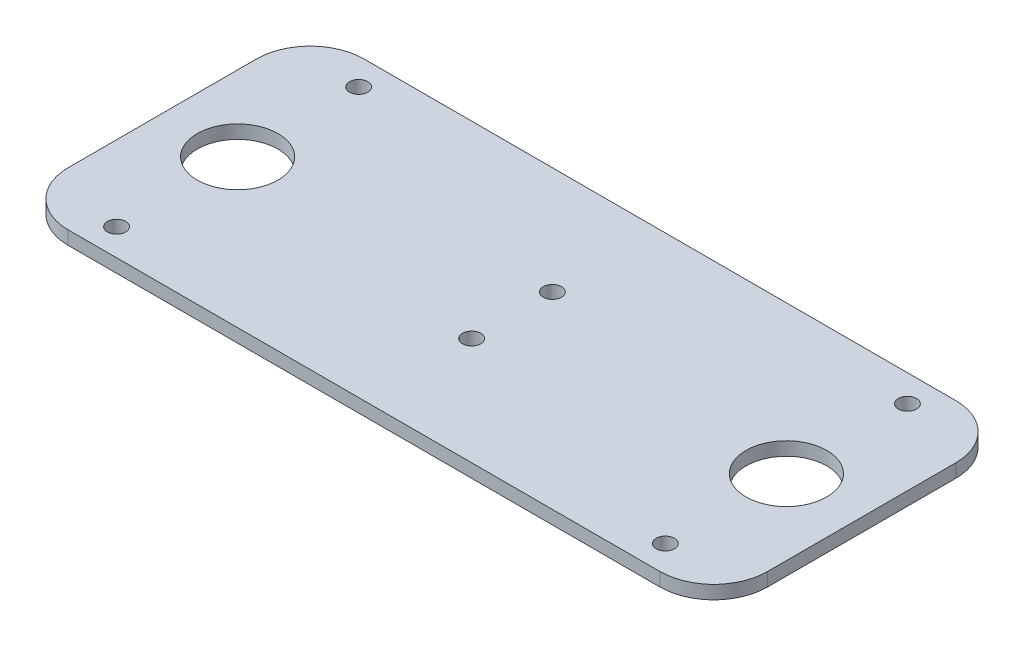
ISO-10303-21;
HEADER;
FILE_DESCRIPTION(('STEP AP214'),'2;1');
FILE_NAME('part.step','',(''),(''),'','','');
FILE_SCHEMA(('AUTOMOTIVE_DESIGN { 1 0 10303 214 1 1 1 1 }'));
ENDSEC;
DATA;
#1=APPLICATION_CONTEXT('core data for automotive mechanical design processes');
#2=APPLICATION_PROTOCOL_DEFINITION('international standard','automotive_design',2000,#1);
#3=PRODUCT_CONTEXT('',#1,'mechanical');
#4=PRODUCT('Part','Part','',(#3));
#5=PRODUCT_RELATED_PRODUCT_CATEGORY('part','',(#4));
#6=PRODUCT_DEFINITION_FORMATION('','',#4);
#7=PRODUCT_DEFINITION_CONTEXT('part definition',#1,'design');
#8=PRODUCT_DEFINITION('design','',#6,#7);
#9=PRODUCT_DEFINITION_SHAPE('','',#8);
#10=(LENGTH_UNIT() NAMED_UNIT(*) SI_UNIT(.MILLI.,.METRE.));
#11=(NAMED_UNIT(*) PLANE_ANGLE_UNIT() SI_UNIT($,.RADIAN.));
#12=(NAMED_UNIT(*) SI_UNIT($,.STERADIAN.) SOLID_ANGLE_UNIT());
#13=UNCERTAINTY_MEASURE_WITH_UNIT(LENGTH_MEASURE(1.E-05),#10,'distance_accuracy_value','');
#14=(GEOMETRIC_REPRESENTATION_CONTEXT(3) GLOBAL_UNCERTAINTY_ASSIGNED_CONTEXT((#13)) GLOBAL_UNIT_ASSIGNED_CONTEXT((#10,
#11,#12)) REPRESENTATION_CONTEXT('',''));
#15=CARTESIAN_POINT('',(0.,0.,0.));
#16=DIRECTION('',(0.,0.,1.));
#17=DIRECTION('',(1.,0.,0.));
#18=AXIS2_PLACEMENT_3D('',#15,#16,#17);
#19=CARTESIAN_POINT('',(10.,2.5,-45.));
#20=DIRECTION('',(0.,-1.,0.));
#21=DIRECTION('',(0.,0.,-1.));
#22=AXIS2_PLACEMENT_3D('',#19,#20,#21);
#23=CYLINDRICAL_SURFACE('',#22,10.);
#24=CARTESIAN_POINT('',(10.,0.,-45.));
#25=DIRECTION('',(0.,1.,0.));
#26=DIRECTION('',(0.,0.,1.));
#27=AXIS2_PLACEMENT_3D('',#24,#25,#26);
#28=CIRCLE('',#27,10.);
#29=CARTESIAN_POINT('',(10.0000000000001,0.,-55.));
#30=VERTEX_POINT('',#29);
#31=CARTESIAN_POINT('',(0.,0.,-44.9999999999999));
#32=VERTEX_POINT('',#31);
#33=EDGE_CURVE('E137',#30,#32,#28,.T.);
#34=ORIENTED_EDGE('',*,*,#33,.T.);
#35=DIRECTION('',(0.,-1.,0.));
#36=VECTOR('',#35,1.);
#37=CARTESIAN_POINT('',(0.,2.5,-44.9999999999999));
#38=LINE('',#37,#36);
#39=CARTESIAN_POINT('',(0.,2.5,-44.9999999999999));
#40=VERTEX_POINT('',#39);
#41=EDGE_CURVE('E11',#40,#32,#38,.T.);
#42=ORIENTED_EDGE('',*,*,#41,.F.);
#43=CARTESIAN_POINT('',(10.,2.5,-45.));
#44=DIRECTION('',(0.,1.,0.));
#45=DIRECTION('',(0.,0.,1.));
#46=AXIS2_PLACEMENT_3D('',#43,#44,#45);
#47=CIRCLE('',#46,10.);
#48=CARTESIAN_POINT('',(10.0000000000001,2.5,-55.));
#49=VERTEX_POINT('',#48);
#50=EDGE_CURVE('E152',#49,#40,#47,.T.);
#51=ORIENTED_EDGE('',*,*,#50,.F.);
#52=DIRECTION('',(0.,-1.,0.));
#53=VECTOR('',#52,1.);
#54=CARTESIAN_POINT('',(10.0000000000001,2.5,-55.));
#55=LINE('',#54,#53);
#56=EDGE_CURVE('E133',#49,#30,#55,.T.);
#57=ORIENTED_EDGE('',*,*,#56,.T.);
#58=EDGE_LOOP('',(#34,#42,#51,#57));
#59=FACE_BOUND('',#58,.T.);
#60=ADVANCED_FACE('F41',(#59),#23,.T.);
#61=CARTESIAN_POINT('',(0.,2.5,-10.0000000000001));
#62=DIRECTION('',(1.,0.,0.));
#63=DIRECTION('',(0.,0.,-1.));
#64=AXIS2_PLACEMENT_3D('',#61,#62,#63);
#65=PLANE('',#64);
#66=DIRECTION('',(0.,0.,1.));
#67=VECTOR('',#66,1.);
#68=CARTESIAN_POINT('',(0.,0.,-10.0000000000001));
#69=LINE('',#68,#67);
#70=CARTESIAN_POINT('',(0.,0.,-10.0000000000001));
#71=VERTEX_POINT('',#70);
#72=EDGE_CURVE('E140',#32,#71,#69,.T.);
#73=ORIENTED_EDGE('',*,*,#72,.T.);
#74=DIRECTION('',(0.,-1.,0.));
#75=VECTOR('',#74,1.);
#76=CARTESIAN_POINT('',(0.,2.5,-10.0000000000001));
#77=LINE('',#76,#75);
#78=CARTESIAN_POINT('',(0.,2.5,-10.0000000000001));
#79=VERTEX_POINT('',#78);
#80=EDGE_CURVE('E49',#79,#71,#77,.T.);
#81=ORIENTED_EDGE('',*,*,#80,.F.);
#82=DIRECTION('',(0.,0.,1.));
#83=VECTOR('',#82,1.);
#84=CARTESIAN_POINT('',(0.,2.5,-10.0000000000001));
#85=LINE('',#84,#83);
#86=EDGE_CURVE('E100',#40,#79,#85,.T.);
#87=ORIENTED_EDGE('',*,*,#86,.F.);
#88=ORIENTED_EDGE('',*,*,#41,.T.);
#89=EDGE_LOOP('',(#73,#81,#87,#88));
#90=FACE_BOUND('',#89,.T.);
#91=ADVANCED_FACE('F275',(#90),#65,.F.);
#92=CARTESIAN_POINT('',(10.,2.5,-10.));
#93=DIRECTION('',(0.,-1.,0.));
#94=DIRECTION('',(0.,0.,-1.));
#95=AXIS2_PLACEMENT_3D('',#92,#93,#94);
#96=CYLINDRICAL_SURFACE('',#95,10.);
#97=CARTESIAN_POINT('',(10.,0.,-10.));
#98=DIRECTION('',(0.,1.,0.));
#99=DIRECTION('',(0.,0.,1.));
#100=AXIS2_PLACEMENT_3D('',#97,#98,#99);
#101=CIRCLE('',#100,10.);
#102=CARTESIAN_POINT('',(10.0000000000001,0.,0.));
#103=VERTEX_POINT('',#102);
#104=EDGE_CURVE('E143',#71,#103,#101,.T.);
#105=ORIENTED_EDGE('',*,*,#104,.T.);
#106=DIRECTION('',(0.,-1.,0.));
#107=VECTOR('',#106,1.);
#108=CARTESIAN_POINT('',(10.0000000000001,2.5,0.));
#109=LINE('',#108,#107);
#110=CARTESIAN_POINT('',(10.0000000000001,2.5,0.));
#111=VERTEX_POINT('',#110);
#112=EDGE_CURVE('E159',#111,#103,#109,.T.);
#113=ORIENTED_EDGE('',*,*,#112,.F.);
#114=CARTESIAN_POINT('',(10.,2.5,-10.));
#115=DIRECTION('',(0.,1.,0.));
#116=DIRECTION('',(0.,0.,1.));
#117=AXIS2_PLACEMENT_3D('',#114,#115,#116);
#118=CIRCLE('',#117,10.);
#119=EDGE_CURVE('E167',#79,#111,#118,.T.);
#120=ORIENTED_EDGE('',*,*,#119,.F.);
#121=ORIENTED_EDGE('',*,*,#80,.T.);
#122=EDGE_LOOP('',(#105,#113,#120,#121));
#123=FACE_BOUND('',#122,.T.);
#124=ADVANCED_FACE('F165',(#123),#96,.T.);
#125=CARTESIAN_POINT('',(10.0000000000001,2.5,0.));
#126=DIRECTION('',(0.,0.,-1.));
#127=DIRECTION('',(-1.,0.,0.));
#128=AXIS2_PLACEMENT_3D('',#125,#126,#127);
#129=PLANE('',#128);
#130=DIRECTION('',(1.,0.,0.));
#131=VECTOR('',#130,1.);
#132=CARTESIAN_POINT('',(10.0000000000001,0.,0.));
#133=LINE('',#132,#131);
#134=CARTESIAN_POINT('',(120.,0.,0.));
#135=VERTEX_POINT('',#134);
#136=EDGE_CURVE('E145',#103,#135,#133,.T.);
#137=ORIENTED_EDGE('',*,*,#136,.T.);
#138=DIRECTION('',(0.,-1.,0.));
#139=VECTOR('',#138,1.);
#140=CARTESIAN_POINT('',(120.,2.5,0.));
#141=LINE('',#140,#139);
#142=CARTESIAN_POINT('',(120.,2.5,0.));
#143=VERTEX_POINT('',#142);
#144=EDGE_CURVE('E156',#143,#135,#141,.T.);
#145=ORIENTED_EDGE('',*,*,#144,.F.);
#146=DIRECTION('',(1.,0.,0.));
#147=VECTOR('',#146,1.);
#148=CARTESIAN_POINT('',(10.0000000000001,2.5,0.));
#149=LINE('',#148,#147);
#150=EDGE_CURVE('E179',#111,#143,#149,.T.);
#151=ORIENTED_EDGE('',*,*,#150,.F.);
#152=ORIENTED_EDGE('',*,*,#112,.T.);
#153=EDGE_LOOP('',(#137,#145,#151,#152));
#154=FACE_BOUND('',#153,.T.);
#155=ADVANCED_FACE('F175',(#154),#129,.F.);
#156=CARTESIAN_POINT('',(120.,2.5,-10.));
#157=DIRECTION('',(0.,-1.,0.));
#158=DIRECTION('',(0.,0.,-1.));
#159=AXIS2_PLACEMENT_3D('',#156,#157,#158);
#160=CYLINDRICAL_SURFACE('',#159,10.);
#161=CARTESIAN_POINT('',(120.,0.,-10.));
#162=DIRECTION('',(0.,1.,0.));
#163=DIRECTION('',(0.,0.,-1.));
#164=AXIS2_PLACEMENT_3D('',#161,#162,#163);
#165=CIRCLE('',#164,10.);
#166=CARTESIAN_POINT('',(130.,0.,-10.0000000000001));
#167=VERTEX_POINT('',#166);
#168=EDGE_CURVE('E147',#135,#167,#165,.T.);
#169=ORIENTED_EDGE('',*,*,#168,.T.);
#170=DIRECTION('',(0.,-1.,0.));
#171=VECTOR('',#170,1.);
#172=CARTESIAN_POINT('',(130.,2.5,-10.0000000000001));
#173=LINE('',#172,#171);
#174=CARTESIAN_POINT('',(130.,2.5,-10.0000000000001));
#175=VERTEX_POINT('',#174);
#176=EDGE_CURVE('E128',#175,#167,#173,.T.);
#177=ORIENTED_EDGE('',*,*,#176,.F.);
#178=CARTESIAN_POINT('',(120.,2.5,-10.));
#179=DIRECTION('',(0.,1.,0.));
#180=DIRECTION('',(0.,0.,-1.));
#181=AXIS2_PLACEMENT_3D('',#178,#179,#180);
#182=CIRCLE('',#181,10.);
#183=EDGE_CURVE('E119',#143,#175,#182,.T.);
#184=ORIENTED_EDGE('',*,*,#183,.F.);
#185=ORIENTED_EDGE('',*,*,#144,.T.);
#186=EDGE_LOOP('',(#169,#177,#184,#185));
#187=FACE_BOUND('',#186,.T.);
#188=ADVANCED_FACE('F178',(#187),#160,.T.);
#189=CARTESIAN_POINT('',(130.,2.5,-10.0000000000001));
#190=DIRECTION('',(-1.,0.,0.));
#191=DIRECTION('',(0.,0.,1.));
#192=AXIS2_PLACEMENT_3D('',#189,#190,#191);
#193=PLANE('',#192);
#194=DIRECTION('',(0.,0.,-1.));
#195=VECTOR('',#194,1.);
#196=CARTESIAN_POINT('',(130.,0.,-10.0000000000001));
#197=LINE('',#196,#195);
#198=CARTESIAN_POINT('',(130.,0.,-44.9999999999999));
#199=VERTEX_POINT('',#198);
#200=EDGE_CURVE('E127',#167,#199,#197,.T.);
#201=ORIENTED_EDGE('',*,*,#200,.T.);
#202=DIRECTION('',(0.,-1.,0.));
#203=VECTOR('',#202,1.);
#204=CARTESIAN_POINT('',(130.,2.5,-44.9999999999999));
#205=LINE('',#204,#203);
#206=CARTESIAN_POINT('',(130.,2.5,-44.9999999999999));
#207=VERTEX_POINT('',#206);
#208=EDGE_CURVE('E124',#207,#199,#205,.T.);
#209=ORIENTED_EDGE('',*,*,#208,.F.);
#210=DIRECTION('',(0.,0.,-1.));
#211=VECTOR('',#210,1.);
#212=CARTESIAN_POINT('',(130.,2.5,-10.0000000000001));
#213=LINE('',#212,#211);
#214=EDGE_CURVE('E113',#175,#207,#213,.T.);
#215=ORIENTED_EDGE('',*,*,#214,.F.);
#216=ORIENTED_EDGE('',*,*,#176,.T.);
#217=EDGE_LOOP('',(#201,#209,#215,#216));
#218=FACE_BOUND('',#217,.T.);
#219=ADVANCED_FACE('F125',(#218),#193,.F.);
#220=CARTESIAN_POINT('',(120.,2.5,-45.));
#221=DIRECTION('',(0.,-1.,0.));
#222=DIRECTION('',(0.,0.,-1.));
#223=AXIS2_PLACEMENT_3D('',#220,#221,#222);
#224=CYLINDRICAL_SURFACE('',#223,10.);
#225=CARTESIAN_POINT('',(120.,0.,-45.));
#226=DIRECTION('',(0.,1.,0.));
#227=DIRECTION('',(0.,0.,-1.));
#228=AXIS2_PLACEMENT_3D('',#225,#226,#227);
#229=CIRCLE('',#228,10.);
#230=CARTESIAN_POINT('',(120.,0.,-55.));
#231=VERTEX_POINT('',#230);
#232=EDGE_CURVE('E86',#199,#231,#229,.T.);
#233=ORIENTED_EDGE('',*,*,#232,.T.);
#234=DIRECTION('',(0.,-1.,0.));
#235=VECTOR('',#234,1.);
#236=CARTESIAN_POINT('',(120.,2.5,-55.));
#237=LINE('',#236,#235);
#238=CARTESIAN_POINT('',(120.,2.5,-55.));
#239=VERTEX_POINT('',#238);
#240=EDGE_CURVE('E129',#239,#231,#237,.T.);
#241=ORIENTED_EDGE('',*,*,#240,.F.);
#242=CARTESIAN_POINT('',(120.,2.5,-45.));
#243=DIRECTION('',(0.,1.,0.));
#244=DIRECTION('',(0.,0.,-1.));
#245=AXIS2_PLACEMENT_3D('',#242,#243,#244);
#246=CIRCLE('',#245,10.);
#247=EDGE_CURVE('E117',#207,#239,#246,.T.);
#248=ORIENTED_EDGE('',*,*,#247,.F.);
#249=ORIENTED_EDGE('',*,*,#208,.T.);
#250=EDGE_LOOP('',(#233,#241,#248,#249));
#251=FACE_BOUND('',#250,.T.);
#252=ADVANCED_FACE('F131',(#251),#224,.T.);
#253=CARTESIAN_POINT('',(10.0000000000001,2.5,-55.));
#254=DIRECTION('',(0.,0.,1.));
#255=DIRECTION('',(1.,0.,0.));
#256=AXIS2_PLACEMENT_3D('',#253,#254,#255);
#257=PLANE('',#256);
#258=DIRECTION('',(-1.,0.,0.));
#259=VECTOR('',#258,1.);
#260=CARTESIAN_POINT('',(10.0000000000001,0.,-55.));
#261=LINE('',#260,#259);
#262=EDGE_CURVE('E92',#231,#30,#261,.T.);
#263=ORIENTED_EDGE('',*,*,#262,.T.);
#264=ORIENTED_EDGE('',*,*,#56,.F.);
#265=DIRECTION('',(-1.,0.,0.));
#266=VECTOR('',#265,1.);
#267=CARTESIAN_POINT('',(10.0000000000001,2.5,-55.));
#268=LINE('',#267,#266);
#269=EDGE_CURVE('E57',#239,#49,#268,.T.);
#270=ORIENTED_EDGE('',*,*,#269,.F.);
#271=ORIENTED_EDGE('',*,*,#240,.T.);
#272=EDGE_LOOP('',(#263,#264,#270,#271));
#273=FACE_BOUND('',#272,.T.);
#274=ADVANCED_FACE('F244',(#273),#257,.F.);
#275=CARTESIAN_POINT('',(10.,2.5,-45.));
#276=DIRECTION('',(0.,1.,0.));
#277=DIRECTION('',(0.,0.,1.));
#278=AXIS2_PLACEMENT_3D('',#275,#276,#277);
#279=PLANE('',#278);
#280=CARTESIAN_POINT('',(65.,2.5,-20.));
#281=DIRECTION('',(0.,1.,0.));
#282=DIRECTION('',(0.,0.,-1.));
#283=AXIS2_PLACEMENT_3D('',#280,#281,#282);
#284=CIRCLE('',#283,1.7);
#285=CARTESIAN_POINT('',(65.,2.5,-21.7));
#286=VERTEX_POINT('',#285);
#287=EDGE_CURVE('E227',#286,#286,#284,.T.);
#288=ORIENTED_EDGE('',*,*,#287,.F.);
#289=EDGE_LOOP('',(#288));
#290=FACE_BOUND('',#289,.T.);
#291=CARTESIAN_POINT('',(65.,2.5,-35.));
#292=DIRECTION('',(0.,1.,0.));
#293=DIRECTION('',(0.,0.,1.));
#294=AXIS2_PLACEMENT_3D('',#291,#292,#293);
#295=CIRCLE('',#294,1.7);
#296=CARTESIAN_POINT('',(65.,2.5,-33.3));
#297=VERTEX_POINT('',#296);
#298=EDGE_CURVE('E221',#297,#297,#295,.T.);
#299=ORIENTED_EDGE('',*,*,#298,.F.);
#300=EDGE_LOOP('',(#299));
#301=FACE_BOUND('',#300,.T.);
#302=CARTESIAN_POINT('',(116.,2.5,-50.));
#303=DIRECTION('',(0.,1.,0.));
#304=DIRECTION('',(0.,0.,-1.));
#305=AXIS2_PLACEMENT_3D('',#302,#303,#304);
#306=CIRCLE('',#305,1.7);
#307=CARTESIAN_POINT('',(116.,2.5,-51.7));
#308=VERTEX_POINT('',#307);
#309=EDGE_CURVE('E215',#308,#308,#306,.T.);
#310=ORIENTED_EDGE('',*,*,#309,.F.);
#311=EDGE_LOOP('',(#310));
#312=FACE_BOUND('',#311,.T.);
#313=CARTESIAN_POINT('',(116.,2.5,-4.99999999999997));
#314=DIRECTION('',(0.,1.,0.));
#315=DIRECTION('',(0.,0.,-1.));
#316=AXIS2_PLACEMENT_3D('',#313,#314,#315);
#317=CIRCLE('',#316,1.7);
#318=CARTESIAN_POINT('',(116.,2.5,-6.69999999999997));
#319=VERTEX_POINT('',#318);
#320=EDGE_CURVE('E209',#319,#319,#317,.T.);
#321=ORIENTED_EDGE('',*,*,#320,.F.);
#322=EDGE_LOOP('',(#321));
#323=FACE_BOUND('',#322,.T.);
#324=CARTESIAN_POINT('',(14.,2.5,-50.));
#325=DIRECTION('',(0.,1.,0.));
#326=DIRECTION('',(0.,0.,1.));
#327=AXIS2_PLACEMENT_3D('',#324,#325,#326);
#328=CIRCLE('',#327,1.7);
#329=CARTESIAN_POINT('',(14.,2.5,-48.3));
#330=VERTEX_POINT('',#329);
#331=EDGE_CURVE('E203',#330,#330,#328,.T.);
#332=ORIENTED_EDGE('',*,*,#331,.F.);
#333=EDGE_LOOP('',(#332));
#334=FACE_BOUND('',#333,.T.);
#335=CARTESIAN_POINT('',(116.,2.5,-27.5));
#336=DIRECTION('',(0.,1.,0.));
#337=DIRECTION('',(0.,0.,-1.));
#338=AXIS2_PLACEMENT_3D('',#335,#336,#337);
#339=CIRCLE('',#338,7.5);
#340=CARTESIAN_POINT('',(116.,2.5,-35.));
#341=VERTEX_POINT('',#340);
#342=EDGE_CURVE('E197',#341,#341,#339,.T.);
#343=ORIENTED_EDGE('',*,*,#342,.F.);
#344=EDGE_LOOP('',(#343));
#345=FACE_BOUND('',#344,.T.);
#346=CARTESIAN_POINT('',(14.,2.5,-27.5));
#347=DIRECTION('',(0.,1.,0.));
#348=DIRECTION('',(0.,0.,1.));
#349=AXIS2_PLACEMENT_3D('',#346,#347,#348);
#350=CIRCLE('',#349,7.5);
#351=CARTESIAN_POINT('',(14.,2.5,-20.));
#352=VERTEX_POINT('',#351);
#353=EDGE_CURVE('E191',#352,#352,#350,.T.);
#354=ORIENTED_EDGE('',*,*,#353,.F.);
#355=EDGE_LOOP('',(#354));
#356=FACE_BOUND('',#355,.T.);
#357=CARTESIAN_POINT('',(14.,2.5,-5.));
#358=DIRECTION('',(0.,1.,0.));
#359=DIRECTION('',(0.,0.,1.));
#360=AXIS2_PLACEMENT_3D('',#357,#358,#359);
#361=CIRCLE('',#360,1.7);
#362=CARTESIAN_POINT('',(14.,2.5,-3.3));
#363=VERTEX_POINT('',#362);
#364=EDGE_CURVE('E185',#363,#363,#361,.T.);
#365=ORIENTED_EDGE('',*,*,#364,.F.);
#366=EDGE_LOOP('',(#365));
#367=FACE_BOUND('',#366,.T.);
#368=ORIENTED_EDGE('',*,*,#50,.T.);
#369=ORIENTED_EDGE('',*,*,#86,.T.);
#370=ORIENTED_EDGE('',*,*,#119,.T.);
#371=ORIENTED_EDGE('',*,*,#150,.T.);
#372=ORIENTED_EDGE('',*,*,#183,.T.);
#373=ORIENTED_EDGE('',*,*,#214,.T.);
#374=ORIENTED_EDGE('',*,*,#247,.T.);
#375=ORIENTED_EDGE('',*,*,#269,.T.);
#376=EDGE_LOOP('',(#368,#369,#370,#371,#372,#373,#374,#375));
#377=FACE_BOUND('',#376,.T.);
#378=ADVANCED_FACE('F115',(#290,#301,#312,#323,#334,#345,#356,#367,#377),#279,.T.);
#379=CARTESIAN_POINT('',(10.,0.,-45.));
#380=DIRECTION('',(0.,1.,0.));
#381=DIRECTION('',(0.,0.,1.));
#382=AXIS2_PLACEMENT_3D('',#379,#380,#381);
#383=PLANE('',#382);
#384=CARTESIAN_POINT('',(65.,0.,-20.));
#385=DIRECTION('',(0.,1.,0.));
#386=DIRECTION('',(0.,0.,-1.));
#387=AXIS2_PLACEMENT_3D('',#384,#385,#386);
#388=CIRCLE('',#387,1.7);
#389=CARTESIAN_POINT('',(65.,0.,-21.7));
#390=VERTEX_POINT('',#389);
#391=EDGE_CURVE('E224',#390,#390,#388,.T.);
#392=ORIENTED_EDGE('',*,*,#391,.T.);
#393=EDGE_LOOP('',(#392));
#394=FACE_BOUND('',#393,.T.);
#395=CARTESIAN_POINT('',(65.,0.,-35.));
#396=DIRECTION('',(0.,1.,0.));
#397=DIRECTION('',(0.,0.,1.));
#398=AXIS2_PLACEMENT_3D('',#395,#396,#397);
#399=CIRCLE('',#398,1.7);
#400=CARTESIAN_POINT('',(65.,0.,-33.3));
#401=VERTEX_POINT('',#400);
#402=EDGE_CURVE('E218',#401,#401,#399,.T.);
#403=ORIENTED_EDGE('',*,*,#402,.T.);
#404=EDGE_LOOP('',(#403));
#405=FACE_BOUND('',#404,.T.);
#406=CARTESIAN_POINT('',(116.,0.,-50.));
#407=DIRECTION('',(0.,1.,0.));
#408=DIRECTION('',(0.,0.,-1.));
#409=AXIS2_PLACEMENT_3D('',#406,#407,#408);
#410=CIRCLE('',#409,1.7);
#411=CARTESIAN_POINT('',(116.,0.,-51.7));
#412=VERTEX_POINT('',#411);
#413=EDGE_CURVE('E212',#412,#412,#410,.T.);
#414=ORIENTED_EDGE('',*,*,#413,.T.);
#415=EDGE_LOOP('',(#414));
#416=FACE_BOUND('',#415,.T.);
#417=CARTESIAN_POINT('',(116.,0.,-4.99999999999997));
#418=DIRECTION('',(0.,1.,0.));
#419=DIRECTION('',(0.,0.,-1.));
#420=AXIS2_PLACEMENT_3D('',#417,#418,#419);
#421=CIRCLE('',#420,1.7);
#422=CARTESIAN_POINT('',(116.,0.,-6.69999999999997));
#423=VERTEX_POINT('',#422);
#424=EDGE_CURVE('E206',#423,#423,#421,.T.);
#425=ORIENTED_EDGE('',*,*,#424,.T.);
#426=EDGE_LOOP('',(#425));
#427=FACE_BOUND('',#426,.T.);
#428=CARTESIAN_POINT('',(14.,0.,-50.));
#429=DIRECTION('',(0.,1.,0.));
#430=DIRECTION('',(0.,0.,1.));
#431=AXIS2_PLACEMENT_3D('',#428,#429,#430);
#432=CIRCLE('',#431,1.7);
#433=CARTESIAN_POINT('',(14.,0.,-48.3));
#434=VERTEX_POINT('',#433);
#435=EDGE_CURVE('E200',#434,#434,#432,.T.);
#436=ORIENTED_EDGE('',*,*,#435,.T.);
#437=EDGE_LOOP('',(#436));
#438=FACE_BOUND('',#437,.T.);
#439=CARTESIAN_POINT('',(116.,0.,-27.5));
#440=DIRECTION('',(0.,1.,0.));
#441=DIRECTION('',(0.,0.,-1.));
#442=AXIS2_PLACEMENT_3D('',#439,#440,#441);
#443=CIRCLE('',#442,7.5);
#444=CARTESIAN_POINT('',(116.,0.,-35.));
#445=VERTEX_POINT('',#444);
#446=EDGE_CURVE('E194',#445,#445,#443,.T.);
#447=ORIENTED_EDGE('',*,*,#446,.T.);
#448=EDGE_LOOP('',(#447));
#449=FACE_BOUND('',#448,.T.);
#450=CARTESIAN_POINT('',(14.,0.,-27.5));
#451=DIRECTION('',(0.,1.,0.));
#452=DIRECTION('',(0.,0.,1.));
#453=AXIS2_PLACEMENT_3D('',#450,#451,#452);
#454=CIRCLE('',#453,7.5);
#455=CARTESIAN_POINT('',(14.,0.,-20.));
#456=VERTEX_POINT('',#455);
#457=EDGE_CURVE('E188',#456,#456,#454,.T.);
#458=ORIENTED_EDGE('',*,*,#457,.T.);
#459=EDGE_LOOP('',(#458));
#460=FACE_BOUND('',#459,.T.);
#461=CARTESIAN_POINT('',(14.,0.,-5.));
#462=DIRECTION('',(0.,1.,0.));
#463=DIRECTION('',(0.,0.,1.));
#464=AXIS2_PLACEMENT_3D('',#461,#462,#463);
#465=CIRCLE('',#464,1.7);
#466=CARTESIAN_POINT('',(14.,0.,-3.3));
#467=VERTEX_POINT('',#466);
#468=EDGE_CURVE('E141',#467,#467,#465,.T.);
#469=ORIENTED_EDGE('',*,*,#468,.T.);
#470=EDGE_LOOP('',(#469));
#471=FACE_BOUND('',#470,.T.);
#472=ORIENTED_EDGE('',*,*,#33,.F.);
#473=ORIENTED_EDGE('',*,*,#262,.F.);
#474=ORIENTED_EDGE('',*,*,#232,.F.);
#475=ORIENTED_EDGE('',*,*,#200,.F.);
#476=ORIENTED_EDGE('',*,*,#168,.F.);
#477=ORIENTED_EDGE('',*,*,#136,.F.);
#478=ORIENTED_EDGE('',*,*,#104,.F.);
#479=ORIENTED_EDGE('',*,*,#72,.F.);
#480=EDGE_LOOP('',(#472,#473,#474,#475,#476,#477,#478,#479));
#481=FACE_BOUND('',#480,.T.);
#482=ADVANCED_FACE('F171',(#394,#405,#416,#427,#438,#449,#460,#471,#481),#383,.F.);
#483=CARTESIAN_POINT('',(14.,0.,-5.));
#484=DIRECTION('',(0.,1.,0.));
#485=DIRECTION('',(0.,0.,1.));
#486=AXIS2_PLACEMENT_3D('',#483,#484,#485);
#487=CYLINDRICAL_SURFACE('',#486,1.7);
#488=ORIENTED_EDGE('',*,*,#468,.F.);
#489=EDGE_LOOP('',(#488));
#490=FACE_BOUND('',#489,.T.);
#491=ORIENTED_EDGE('',*,*,#364,.T.);
#492=EDGE_LOOP('',(#491));
#493=FACE_BOUND('',#492,.T.);
#494=ADVANCED_FACE('F260',(#490,#493),#487,.F.);
#495=CARTESIAN_POINT('',(14.,0.,-27.5));
#496=DIRECTION('',(0.,1.,0.));
#497=DIRECTION('',(0.,0.,1.));
#498=AXIS2_PLACEMENT_3D('',#495,#496,#497);
#499=CYLINDRICAL_SURFACE('',#498,7.5);
#500=ORIENTED_EDGE('',*,*,#457,.F.);
#501=EDGE_LOOP('',(#500));
#502=FACE_BOUND('',#501,.T.);
#503=ORIENTED_EDGE('',*,*,#353,.T.);
#504=EDGE_LOOP('',(#503));
#505=FACE_BOUND('',#504,.T.);
#506=ADVANCED_FACE('F262',(#502,#505),#499,.F.);
#507=CARTESIAN_POINT('',(116.,0.,-27.5));
#508=DIRECTION('',(0.,1.,0.));
#509=DIRECTION('',(0.,0.,1.));
#510=AXIS2_PLACEMENT_3D('',#507,#508,#509);
#511=CYLINDRICAL_SURFACE('',#510,7.5);
#512=ORIENTED_EDGE('',*,*,#446,.F.);
#513=EDGE_LOOP('',(#512));
#514=FACE_BOUND('',#513,.T.);
#515=ORIENTED_EDGE('',*,*,#342,.T.);
#516=EDGE_LOOP('',(#515));
#517=FACE_BOUND('',#516,.T.);
#518=ADVANCED_FACE('F269',(#514,#517),#511,.F.);
#519=CARTESIAN_POINT('',(14.,0.,-50.));
#520=DIRECTION('',(0.,1.,0.));
#521=DIRECTION('',(0.,0.,1.));
#522=AXIS2_PLACEMENT_3D('',#519,#520,#521);
#523=CYLINDRICAL_SURFACE('',#522,1.7);
#524=ORIENTED_EDGE('',*,*,#435,.F.);
#525=EDGE_LOOP('',(#524));
#526=FACE_BOUND('',#525,.T.);
#527=ORIENTED_EDGE('',*,*,#331,.T.);
#528=EDGE_LOOP('',(#527));
#529=FACE_BOUND('',#528,.T.);
#530=ADVANCED_FACE('F352',(#526,#529),#523,.F.);
#531=CARTESIAN_POINT('',(116.,0.,-4.99999999999997));
#532=DIRECTION('',(0.,1.,0.));
#533=DIRECTION('',(0.,0.,1.));
#534=AXIS2_PLACEMENT_3D('',#531,#532,#533);
#535=CYLINDRICAL_SURFACE('',#534,1.7);
#536=ORIENTED_EDGE('',*,*,#424,.F.);
#537=EDGE_LOOP('',(#536));
#538=FACE_BOUND('',#537,.T.);
#539=ORIENTED_EDGE('',*,*,#320,.T.);
#540=EDGE_LOOP('',(#539));
#541=FACE_BOUND('',#540,.T.);
#542=ADVANCED_FACE('F362',(#538,#541),#535,.F.);
#543=CARTESIAN_POINT('',(116.,0.,-50.));
#544=DIRECTION('',(0.,1.,0.));
#545=DIRECTION('',(0.,0.,1.));
#546=AXIS2_PLACEMENT_3D('',#543,#544,#545);
#547=CYLINDRICAL_SURFACE('',#546,1.7);
#548=ORIENTED_EDGE('',*,*,#413,.F.);
#549=EDGE_LOOP('',(#548));
#550=FACE_BOUND('',#549,.T.);
#551=ORIENTED_EDGE('',*,*,#309,.T.);
#552=EDGE_LOOP('',(#551));
#553=FACE_BOUND('',#552,.T.);
#554=ADVANCED_FACE('F372',(#550,#553),#547,.F.);
#555=CARTESIAN_POINT('',(65.,0.,-35.));
#556=DIRECTION('',(0.,1.,0.));
#557=DIRECTION('',(0.,0.,1.));
#558=AXIS2_PLACEMENT_3D('',#555,#556,#557);
#559=CYLINDRICAL_SURFACE('',#558,1.7);
#560=ORIENTED_EDGE('',*,*,#402,.F.);
#561=EDGE_LOOP('',(#560));
#562=FACE_BOUND('',#561,.T.);
#563=ORIENTED_EDGE('',*,*,#298,.T.);
#564=EDGE_LOOP('',(#563));
#565=FACE_BOUND('',#564,.T.);
#566=ADVANCED_FACE('F238',(#562,#565),#559,.F.);
#567=CARTESIAN_POINT('',(65.,0.,-20.));
#568=DIRECTION('',(0.,1.,0.));
#569=DIRECTION('',(0.,0.,1.));
#570=AXIS2_PLACEMENT_3D('',#567,#568,#569);
#571=CYLINDRICAL_SURFACE('',#570,1.7);
#572=ORIENTED_EDGE('',*,*,#391,.F.);
#573=EDGE_LOOP('',(#572));
#574=FACE_BOUND('',#573,.T.);
#575=ORIENTED_EDGE('',*,*,#287,.T.);
#576=EDGE_LOOP('',(#575));
#577=FACE_BOUND('',#576,.T.);
#578=ADVANCED_FACE('F235',(#574,#577),#571,.F.);
#579=CLOSED_SHELL('',(#60,#91,#124,#155,#188,#219,#252,#274,#378,#482,#494,#506,#518,#530,#542,
#554,#566,#578));
#580=MANIFOLD_SOLID_BREP('B2',#579);
#581=ADVANCED_BREP_SHAPE_REPRESENTATION('',(#18,#580),#14);
#582=SHAPE_DEFINITION_REPRESENTATION(#9,#581);
ENDSEC;
END-ISO-10303-21;
